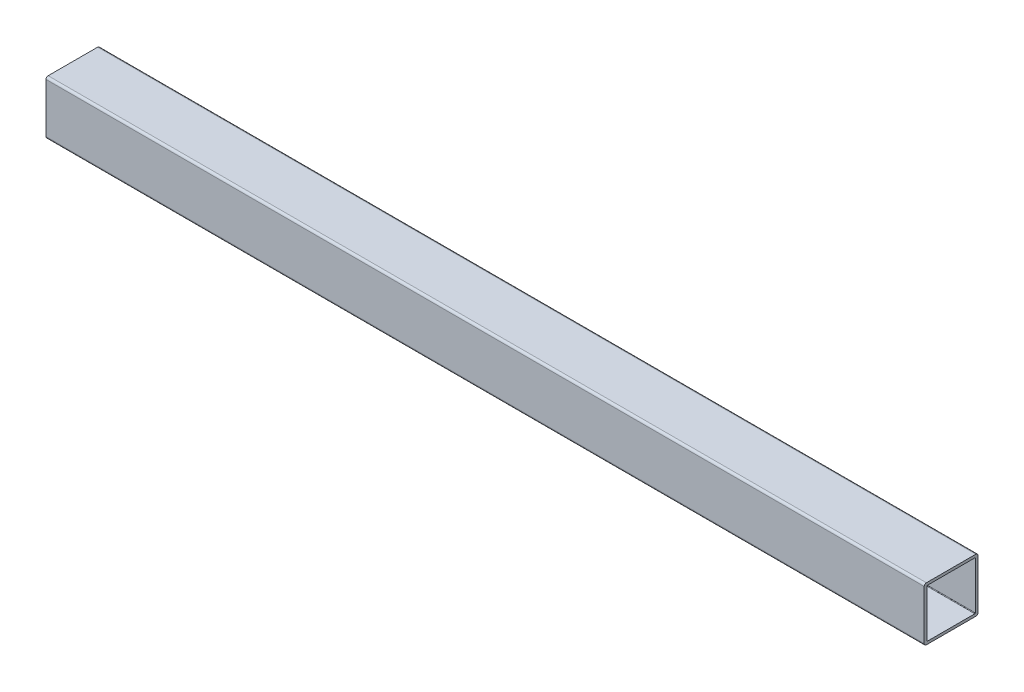
ISO-10303-21;
HEADER;
FILE_DESCRIPTION(('STEP AP214'),'2;1');
FILE_NAME('part.step','',(''),(''),'','','');
FILE_SCHEMA(('AUTOMOTIVE_DESIGN { 1 0 10303 214 1 1 1 1 }'));
ENDSEC;
DATA;
#1=APPLICATION_CONTEXT('core data for automotive mechanical design processes');
#2=APPLICATION_PROTOCOL_DEFINITION('international standard','automotive_design',2000,#1);
#3=PRODUCT_CONTEXT('',#1,'mechanical');
#4=PRODUCT('Part','Part','',(#3));
#5=PRODUCT_RELATED_PRODUCT_CATEGORY('part','',(#4));
#6=PRODUCT_DEFINITION_FORMATION('','',#4);
#7=PRODUCT_DEFINITION_CONTEXT('part definition',#1,'design');
#8=PRODUCT_DEFINITION('design','',#6,#7);
#9=PRODUCT_DEFINITION_SHAPE('','',#8);
#10=(LENGTH_UNIT() NAMED_UNIT(*) SI_UNIT(.MILLI.,.METRE.));
#11=(NAMED_UNIT(*) PLANE_ANGLE_UNIT() SI_UNIT($,.RADIAN.));
#12=(NAMED_UNIT(*) SI_UNIT($,.STERADIAN.) SOLID_ANGLE_UNIT());
#13=UNCERTAINTY_MEASURE_WITH_UNIT(LENGTH_MEASURE(1.E-05),#10,'distance_accuracy_value','');
#14=(GEOMETRIC_REPRESENTATION_CONTEXT(3) GLOBAL_UNCERTAINTY_ASSIGNED_CONTEXT((#13)) GLOBAL_UNIT_ASSIGNED_CONTEXT((#10,
#11,#12)) REPRESENTATION_CONTEXT('',''));
#15=CARTESIAN_POINT('',(0.,0.,0.));
#16=DIRECTION('',(0.,0.,1.));
#17=DIRECTION('',(1.,0.,0.));
#18=AXIS2_PLACEMENT_3D('',#15,#16,#17);
#19=CARTESIAN_POINT('',(-358.3,0.,-487.5));
#20=DIRECTION('',(0.,0.,-1.));
#21=DIRECTION('',(-1.,0.,0.));
#22=AXIS2_PLACEMENT_3D('',#19,#20,#21);
#23=PLANE('',#22);
#24=DIRECTION('',(0.,1.,0.));
#25=VECTOR('',#24,1.);
#26=CARTESIAN_POINT('',(-458.3,100.,-487.5));
#27=LINE('',#26,#25);
#28=CARTESIAN_POINT('',(-458.3,4.,-487.5));
#29=VERTEX_POINT('',#28);
#30=CARTESIAN_POINT('',(-458.3,96.,-487.5));
#31=VERTEX_POINT('',#30);
#32=EDGE_CURVE('E175',#29,#31,#27,.T.);
#33=ORIENTED_EDGE('',*,*,#32,.T.);
#34=DIRECTION('',(1.,0.,0.));
#35=VECTOR('',#34,1.);
#36=CARTESIAN_POINT('',(-358.3,96.,-487.5));
#37=LINE('',#36,#35);
#38=CARTESIAN_POINT('',(1175.,96.,-487.5));
#39=VERTEX_POINT('',#38);
#40=EDGE_CURVE('E216',#31,#39,#37,.T.);
#41=ORIENTED_EDGE('',*,*,#40,.T.);
#42=DIRECTION('',(0.,1.,0.));
#43=VECTOR('',#42,1.);
#44=CARTESIAN_POINT('',(1175.,100.,-487.5));
#45=LINE('',#44,#43);
#46=CARTESIAN_POINT('',(1175.,4.,-487.5));
#47=VERTEX_POINT('',#46);
#48=EDGE_CURVE('E161',#39,#47,#45,.F.);
#49=ORIENTED_EDGE('',*,*,#48,.T.);
#50=DIRECTION('',(1.,0.,0.));
#51=VECTOR('',#50,1.);
#52=CARTESIAN_POINT('',(-358.3,4.,-487.5));
#53=LINE('',#52,#51);
#54=EDGE_CURVE('E214',#47,#29,#53,.F.);
#55=ORIENTED_EDGE('',*,*,#54,.T.);
#56=EDGE_LOOP('',(#33,#41,#49,#55));
#57=FACE_BOUND('',#56,.T.);
#58=ADVANCED_FACE('F19',(#57),#23,.T.);
#59=CARTESIAN_POINT('',(-358.3,100.,-387.5));
#60=DIRECTION('',(0.,0.,1.));
#61=DIRECTION('',(1.,0.,0.));
#62=AXIS2_PLACEMENT_3D('',#59,#60,#61);
#63=PLANE('',#62);
#64=DIRECTION('',(0.,-1.,0.));
#65=VECTOR('',#64,1.);
#66=CARTESIAN_POINT('',(-458.3,100.,-387.5));
#67=LINE('',#66,#65);
#68=CARTESIAN_POINT('',(-458.3,96.,-387.5));
#69=VERTEX_POINT('',#68);
#70=CARTESIAN_POINT('',(-458.3,4.,-387.5));
#71=VERTEX_POINT('',#70);
#72=EDGE_CURVE('E189',#69,#71,#67,.T.);
#73=ORIENTED_EDGE('',*,*,#72,.T.);
#74=DIRECTION('',(-1.,0.,0.));
#75=VECTOR('',#74,1.);
#76=CARTESIAN_POINT('',(-358.3,4.,-387.5));
#77=LINE('',#76,#75);
#78=CARTESIAN_POINT('',(1175.,4.,-387.5));
#79=VERTEX_POINT('',#78);
#80=EDGE_CURVE('E138',#71,#79,#77,.F.);
#81=ORIENTED_EDGE('',*,*,#80,.T.);
#82=DIRECTION('',(0.,1.,0.));
#83=VECTOR('',#82,1.);
#84=CARTESIAN_POINT('',(1175.,100.,-387.5));
#85=LINE('',#84,#83);
#86=CARTESIAN_POINT('',(1175.,96.,-387.5));
#87=VERTEX_POINT('',#86);
#88=EDGE_CURVE('E192',#87,#79,#85,.F.);
#89=ORIENTED_EDGE('',*,*,#88,.F.);
#90=DIRECTION('',(-1.,0.,0.));
#91=VECTOR('',#90,1.);
#92=CARTESIAN_POINT('',(-358.3,96.,-387.5));
#93=LINE('',#92,#91);
#94=EDGE_CURVE('E142',#87,#69,#93,.T.);
#95=ORIENTED_EDGE('',*,*,#94,.T.);
#96=EDGE_LOOP('',(#73,#81,#89,#95));
#97=FACE_BOUND('',#96,.T.);
#98=ADVANCED_FACE('F253',(#97),#63,.T.);
#99=CARTESIAN_POINT('',(1175.,100.,-825.));
#100=DIRECTION('',(-1.,0.,0.));
#101=DIRECTION('',(0.,0.,1.));
#102=AXIS2_PLACEMENT_3D('',#99,#100,#101);
#103=PLANE('',#102);
#104=DIRECTION('',(0.,0.,1.));
#105=VECTOR('',#104,1.);
#106=CARTESIAN_POINT('',(1175.,5.,-825.));
#107=LINE('',#106,#105);
#108=CARTESIAN_POINT('',(1175.,5.,-481.5));
#109=VERTEX_POINT('',#108);
#110=CARTESIAN_POINT('',(1175.,5.,-393.5));
#111=VERTEX_POINT('',#110);
#112=EDGE_CURVE('E361',#109,#111,#107,.T.);
#113=ORIENTED_EDGE('',*,*,#112,.T.);
#114=CARTESIAN_POINT('',(1175.,6.,-393.5));
#115=DIRECTION('',(-1.,0.,0.));
#116=DIRECTION('',(0.,0.,1.));
#117=AXIS2_PLACEMENT_3D('',#114,#115,#116);
#118=CIRCLE('',#117,1.);
#119=CARTESIAN_POINT('',(1175.,6.00000000000001,-392.5));
#120=VERTEX_POINT('',#119);
#121=EDGE_CURVE('E326',#111,#120,#118,.T.);
#122=ORIENTED_EDGE('',*,*,#121,.T.);
#123=DIRECTION('',(0.,1.,0.));
#124=VECTOR('',#123,1.);
#125=CARTESIAN_POINT('',(1175.,100.,-392.5));
#126=LINE('',#125,#124);
#127=CARTESIAN_POINT('',(1175.,94.,-392.5));
#128=VERTEX_POINT('',#127);
#129=EDGE_CURVE('E190',#120,#128,#126,.T.);
#130=ORIENTED_EDGE('',*,*,#129,.T.);
#131=CARTESIAN_POINT('',(1175.,94.,-393.5));
#132=DIRECTION('',(-1.,0.,0.));
#133=DIRECTION('',(0.,0.,1.));
#134=AXIS2_PLACEMENT_3D('',#131,#132,#133);
#135=CIRCLE('',#134,1.);
#136=CARTESIAN_POINT('',(1175.,95.,-393.5));
#137=VERTEX_POINT('',#136);
#138=EDGE_CURVE('E332',#128,#137,#135,.T.);
#139=ORIENTED_EDGE('',*,*,#138,.T.);
#140=DIRECTION('',(0.,0.,-1.));
#141=VECTOR('',#140,1.);
#142=CARTESIAN_POINT('',(1175.,95.,-825.));
#143=LINE('',#142,#141);
#144=CARTESIAN_POINT('',(1175.,95.,-481.5));
#145=VERTEX_POINT('',#144);
#146=EDGE_CURVE('E186',#137,#145,#143,.T.);
#147=ORIENTED_EDGE('',*,*,#146,.T.);
#148=CARTESIAN_POINT('',(1175.,94.,-481.5));
#149=DIRECTION('',(-1.,0.,0.));
#150=DIRECTION('',(0.,0.,1.));
#151=AXIS2_PLACEMENT_3D('',#148,#149,#150);
#152=CIRCLE('',#151,1.);
#153=CARTESIAN_POINT('',(1175.,94.,-482.5));
#154=VERTEX_POINT('',#153);
#155=EDGE_CURVE('E12',#145,#154,#152,.T.);
#156=ORIENTED_EDGE('',*,*,#155,.T.);
#157=DIRECTION('',(0.,-1.,0.));
#158=VECTOR('',#157,1.);
#159=CARTESIAN_POINT('',(1175.,100.,-482.5));
#160=LINE('',#159,#158);
#161=CARTESIAN_POINT('',(1175.,6.00000000000001,-482.5));
#162=VERTEX_POINT('',#161);
#163=EDGE_CURVE('E355',#154,#162,#160,.T.);
#164=ORIENTED_EDGE('',*,*,#163,.T.);
#165=CARTESIAN_POINT('',(1175.,6.,-481.5));
#166=DIRECTION('',(-1.,0.,0.));
#167=DIRECTION('',(0.,0.,1.));
#168=AXIS2_PLACEMENT_3D('',#165,#166,#167);
#169=CIRCLE('',#168,1.);
#170=EDGE_CURVE('E319',#162,#109,#169,.T.);
#171=ORIENTED_EDGE('',*,*,#170,.T.);
#172=EDGE_LOOP('',(#113,#122,#130,#139,#147,#156,#164,#171));
#173=FACE_BOUND('',#172,.T.);
#174=ORIENTED_EDGE('',*,*,#88,.T.);
#175=CARTESIAN_POINT('',(1175.,4.,-391.5));
#176=DIRECTION('',(-1.,0.,0.));
#177=DIRECTION('',(0.,0.,1.));
#178=AXIS2_PLACEMENT_3D('',#175,#176,#177);
#179=CIRCLE('',#178,4.);
#180=CARTESIAN_POINT('',(1175.,0.,-391.5));
#181=VERTEX_POINT('',#180);
#182=EDGE_CURVE('E203',#79,#181,#179,.F.);
#183=ORIENTED_EDGE('',*,*,#182,.T.);
#184=DIRECTION('',(0.,0.,-1.));
#185=VECTOR('',#184,1.);
#186=CARTESIAN_POINT('',(1175.,0.,0.));
#187=LINE('',#186,#185);
#188=CARTESIAN_POINT('',(1175.,0.,-483.5));
#189=VERTEX_POINT('',#188);
#190=EDGE_CURVE('E153',#181,#189,#187,.T.);
#191=ORIENTED_EDGE('',*,*,#190,.T.);
#192=CARTESIAN_POINT('',(1175.,4.,-483.5));
#193=DIRECTION('',(-1.,0.,0.));
#194=DIRECTION('',(0.,0.,1.));
#195=AXIS2_PLACEMENT_3D('',#192,#193,#194);
#196=CIRCLE('',#195,4.);
#197=EDGE_CURVE('E202',#189,#47,#196,.F.);
#198=ORIENTED_EDGE('',*,*,#197,.T.);
#199=ORIENTED_EDGE('',*,*,#48,.F.);
#200=CARTESIAN_POINT('',(1175.,96.,-483.5));
#201=DIRECTION('',(-1.,0.,0.));
#202=DIRECTION('',(0.,0.,1.));
#203=AXIS2_PLACEMENT_3D('',#200,#201,#202);
#204=CIRCLE('',#203,4.);
#205=CARTESIAN_POINT('',(1175.,100.,-483.5));
#206=VERTEX_POINT('',#205);
#207=EDGE_CURVE('E209',#39,#206,#204,.F.);
#208=ORIENTED_EDGE('',*,*,#207,.T.);
#209=DIRECTION('',(0.,0.,-1.));
#210=VECTOR('',#209,1.);
#211=CARTESIAN_POINT('',(1175.,100.,0.));
#212=LINE('',#211,#210);
#213=CARTESIAN_POINT('',(1175.,100.,-391.5));
#214=VERTEX_POINT('',#213);
#215=EDGE_CURVE('E160',#214,#206,#212,.T.);
#216=ORIENTED_EDGE('',*,*,#215,.F.);
#217=CARTESIAN_POINT('',(1175.,96.,-391.5));
#218=DIRECTION('',(-1.,0.,0.));
#219=DIRECTION('',(0.,0.,1.));
#220=AXIS2_PLACEMENT_3D('',#217,#218,#219);
#221=CIRCLE('',#220,4.);
#222=EDGE_CURVE('E205',#214,#87,#221,.F.);
#223=ORIENTED_EDGE('',*,*,#222,.T.);
#224=EDGE_LOOP('',(#174,#183,#191,#198,#199,#208,#216,#223));
#225=FACE_BOUND('',#224,.T.);
#226=ADVANCED_FACE('F200',(#173,#225),#103,.F.);
#227=CARTESIAN_POINT('',(-458.3,100.,-387.5));
#228=DIRECTION('',(1.,0.,0.));
#229=DIRECTION('',(0.,0.,-1.));
#230=AXIS2_PLACEMENT_3D('',#227,#228,#229);
#231=PLANE('',#230);
#232=DIRECTION('',(0.,0.,1.));
#233=VECTOR('',#232,1.);
#234=CARTESIAN_POINT('',(-458.3,95.,-387.5));
#235=LINE('',#234,#233);
#236=CARTESIAN_POINT('',(-458.3,95.,-481.5));
#237=VERTEX_POINT('',#236);
#238=CARTESIAN_POINT('',(-458.3,95.,-393.5));
#239=VERTEX_POINT('',#238);
#240=EDGE_CURVE('E263',#237,#239,#235,.T.);
#241=ORIENTED_EDGE('',*,*,#240,.T.);
#242=CARTESIAN_POINT('',(-458.3,94.,-393.5));
#243=DIRECTION('',(1.,0.,0.));
#244=DIRECTION('',(0.,0.,-1.));
#245=AXIS2_PLACEMENT_3D('',#242,#243,#244);
#246=CIRCLE('',#245,1.);
#247=CARTESIAN_POINT('',(-458.3,94.,-392.5));
#248=VERTEX_POINT('',#247);
#249=EDGE_CURVE('E334',#239,#248,#246,.T.);
#250=ORIENTED_EDGE('',*,*,#249,.T.);
#251=DIRECTION('',(0.,-1.,0.));
#252=VECTOR('',#251,1.);
#253=CARTESIAN_POINT('',(-458.3,100.,-392.5));
#254=LINE('',#253,#252);
#255=CARTESIAN_POINT('',(-458.3,6.00000000000001,-392.5));
#256=VERTEX_POINT('',#255);
#257=EDGE_CURVE('E260',#248,#256,#254,.T.);
#258=ORIENTED_EDGE('',*,*,#257,.T.);
#259=CARTESIAN_POINT('',(-458.3,6.,-393.5));
#260=DIRECTION('',(1.,0.,0.));
#261=DIRECTION('',(0.,0.,-1.));
#262=AXIS2_PLACEMENT_3D('',#259,#260,#261);
#263=CIRCLE('',#262,1.);
#264=CARTESIAN_POINT('',(-458.3,5.,-393.5));
#265=VERTEX_POINT('',#264);
#266=EDGE_CURVE('E330',#256,#265,#263,.T.);
#267=ORIENTED_EDGE('',*,*,#266,.T.);
#268=DIRECTION('',(0.,0.,-1.));
#269=VECTOR('',#268,1.);
#270=CARTESIAN_POINT('',(-458.3,5.,-387.5));
#271=LINE('',#270,#269);
#272=CARTESIAN_POINT('',(-458.3,5.,-481.5));
#273=VERTEX_POINT('',#272);
#274=EDGE_CURVE('E198',#265,#273,#271,.T.);
#275=ORIENTED_EDGE('',*,*,#274,.T.);
#276=CARTESIAN_POINT('',(-458.3,6.,-481.5));
#277=DIRECTION('',(1.,0.,0.));
#278=DIRECTION('',(0.,0.,-1.));
#279=AXIS2_PLACEMENT_3D('',#276,#277,#278);
#280=CIRCLE('',#279,1.);
#281=CARTESIAN_POINT('',(-458.3,6.00000000000001,-482.5));
#282=VERTEX_POINT('',#281);
#283=EDGE_CURVE('E324',#273,#282,#280,.T.);
#284=ORIENTED_EDGE('',*,*,#283,.T.);
#285=DIRECTION('',(0.,1.,0.));
#286=VECTOR('',#285,1.);
#287=CARTESIAN_POINT('',(-458.3,100.,-482.5));
#288=LINE('',#287,#286);
#289=CARTESIAN_POINT('',(-458.3,94.,-482.5));
#290=VERTEX_POINT('',#289);
#291=EDGE_CURVE('E194',#282,#290,#288,.T.);
#292=ORIENTED_EDGE('',*,*,#291,.T.);
#293=CARTESIAN_POINT('',(-458.3,94.,-481.5));
#294=DIRECTION('',(1.,0.,0.));
#295=DIRECTION('',(0.,0.,-1.));
#296=AXIS2_PLACEMENT_3D('',#293,#294,#295);
#297=CIRCLE('',#296,1.);
#298=EDGE_CURVE('E27',#290,#237,#297,.T.);
#299=ORIENTED_EDGE('',*,*,#298,.T.);
#300=EDGE_LOOP('',(#241,#250,#258,#267,#275,#284,#292,#299));
#301=FACE_BOUND('',#300,.T.);
#302=CARTESIAN_POINT('',(-458.3,4.,-391.5));
#303=DIRECTION('',(1.,0.,0.));
#304=DIRECTION('',(0.,0.,-1.));
#305=AXIS2_PLACEMENT_3D('',#302,#303,#304);
#306=CIRCLE('',#305,4.);
#307=CARTESIAN_POINT('',(-458.3,0.,-391.5));
#308=VERTEX_POINT('',#307);
#309=EDGE_CURVE('E133',#308,#71,#306,.F.);
#310=ORIENTED_EDGE('',*,*,#309,.T.);
#311=ORIENTED_EDGE('',*,*,#72,.F.);
#312=CARTESIAN_POINT('',(-458.3,96.,-391.5));
#313=DIRECTION('',(1.,0.,0.));
#314=DIRECTION('',(0.,0.,-1.));
#315=AXIS2_PLACEMENT_3D('',#312,#313,#314);
#316=CIRCLE('',#315,4.);
#317=CARTESIAN_POINT('',(-458.3,100.,-391.5));
#318=VERTEX_POINT('',#317);
#319=EDGE_CURVE('E143',#69,#318,#316,.F.);
#320=ORIENTED_EDGE('',*,*,#319,.T.);
#321=DIRECTION('',(0.,0.,1.));
#322=VECTOR('',#321,1.);
#323=CARTESIAN_POINT('',(-458.3,100.,-387.5));
#324=LINE('',#323,#322);
#325=CARTESIAN_POINT('',(-458.3,100.,-483.5));
#326=VERTEX_POINT('',#325);
#327=EDGE_CURVE('E166',#326,#318,#324,.T.);
#328=ORIENTED_EDGE('',*,*,#327,.F.);
#329=CARTESIAN_POINT('',(-458.3,96.,-483.5));
#330=DIRECTION('',(1.,0.,0.));
#331=DIRECTION('',(0.,0.,-1.));
#332=AXIS2_PLACEMENT_3D('',#329,#330,#331);
#333=CIRCLE('',#332,4.);
#334=EDGE_CURVE('E231',#326,#31,#333,.F.);
#335=ORIENTED_EDGE('',*,*,#334,.T.);
#336=ORIENTED_EDGE('',*,*,#32,.F.);
#337=CARTESIAN_POINT('',(-458.3,4.,-483.5));
#338=DIRECTION('',(1.,0.,0.));
#339=DIRECTION('',(0.,0.,-1.));
#340=AXIS2_PLACEMENT_3D('',#337,#338,#339);
#341=CIRCLE('',#340,4.);
#342=CARTESIAN_POINT('',(-458.3,0.,-483.5));
#343=VERTEX_POINT('',#342);
#344=EDGE_CURVE('E154',#29,#343,#341,.F.);
#345=ORIENTED_EDGE('',*,*,#344,.T.);
#346=DIRECTION('',(0.,0.,-1.));
#347=VECTOR('',#346,1.);
#348=CARTESIAN_POINT('',(-458.3,0.,0.));
#349=LINE('',#348,#347);
#350=EDGE_CURVE('E150',#308,#343,#349,.T.);
#351=ORIENTED_EDGE('',*,*,#350,.F.);
#352=EDGE_LOOP('',(#310,#311,#320,#328,#335,#336,#345,#351));
#353=FACE_BOUND('',#352,.T.);
#354=ADVANCED_FACE('F157',(#301,#353),#231,.F.);
#355=CARTESIAN_POINT('',(0.,0.,0.));
#356=DIRECTION('',(0.,-1.,0.));
#357=DIRECTION('',(0.,0.,-1.));
#358=AXIS2_PLACEMENT_3D('',#355,#356,#357);
#359=PLANE('',#358);
#360=ORIENTED_EDGE('',*,*,#190,.F.);
#361=DIRECTION('',(-1.,0.,0.));
#362=VECTOR('',#361,1.);
#363=CARTESIAN_POINT('',(0.,0.,-391.5));
#364=LINE('',#363,#362);
#365=EDGE_CURVE('E137',#181,#308,#364,.T.);
#366=ORIENTED_EDGE('',*,*,#365,.T.);
#367=ORIENTED_EDGE('',*,*,#350,.T.);
#368=DIRECTION('',(1.,0.,0.));
#369=VECTOR('',#368,1.);
#370=CARTESIAN_POINT('',(0.,0.,-483.5));
#371=LINE('',#370,#369);
#372=EDGE_CURVE('E155',#343,#189,#371,.T.);
#373=ORIENTED_EDGE('',*,*,#372,.T.);
#374=EDGE_LOOP('',(#360,#366,#367,#373));
#375=FACE_BOUND('',#374,.T.);
#376=ADVANCED_FACE('F148',(#375),#359,.T.);
#377=CARTESIAN_POINT('',(358.3,100.,925.));
#378=DIRECTION('',(0.,1.,0.));
#379=DIRECTION('',(0.,0.,1.));
#380=AXIS2_PLACEMENT_3D('',#377,#378,#379);
#381=PLANE('',#380);
#382=ORIENTED_EDGE('',*,*,#327,.T.);
#383=DIRECTION('',(-1.,0.,0.));
#384=VECTOR('',#383,1.);
#385=CARTESIAN_POINT('',(358.3,100.,-391.5));
#386=LINE('',#385,#384);
#387=EDGE_CURVE('E207',#318,#214,#386,.F.);
#388=ORIENTED_EDGE('',*,*,#387,.T.);
#389=ORIENTED_EDGE('',*,*,#215,.T.);
#390=DIRECTION('',(1.,0.,0.));
#391=VECTOR('',#390,1.);
#392=CARTESIAN_POINT('',(358.3,100.,-483.5));
#393=LINE('',#392,#391);
#394=EDGE_CURVE('E204',#206,#326,#393,.F.);
#395=ORIENTED_EDGE('',*,*,#394,.T.);
#396=EDGE_LOOP('',(#382,#388,#389,#395));
#397=FACE_BOUND('',#396,.T.);
#398=ADVANCED_FACE('F244',(#397),#381,.T.);
#399=CARTESIAN_POINT('',(1275.,95.,-392.5));
#400=DIRECTION('',(0.,1.,0.));
#401=DIRECTION('',(0.,0.,1.));
#402=AXIS2_PLACEMENT_3D('',#399,#400,#401);
#403=PLANE('',#402);
#404=ORIENTED_EDGE('',*,*,#146,.F.);
#405=DIRECTION('',(-1.,0.,0.));
#406=VECTOR('',#405,1.);
#407=CARTESIAN_POINT('',(-458.3,95.,-393.5));
#408=LINE('',#407,#406);
#409=EDGE_CURVE('E347',#137,#239,#408,.T.);
#410=ORIENTED_EDGE('',*,*,#409,.T.);
#411=ORIENTED_EDGE('',*,*,#240,.F.);
#412=DIRECTION('',(-1.,0.,0.));
#413=VECTOR('',#412,1.);
#414=CARTESIAN_POINT('',(1175.,95.,-481.5));
#415=LINE('',#414,#413);
#416=EDGE_CURVE('E220',#237,#145,#415,.F.);
#417=ORIENTED_EDGE('',*,*,#416,.T.);
#418=EDGE_LOOP('',(#404,#410,#411,#417));
#419=FACE_BOUND('',#418,.T.);
#420=ADVANCED_FACE('F282',(#419),#403,.F.);
#421=CARTESIAN_POINT('',(1275.,5.,-392.5));
#422=DIRECTION('',(0.,0.,1.));
#423=DIRECTION('',(1.,0.,0.));
#424=AXIS2_PLACEMENT_3D('',#421,#422,#423);
#425=PLANE('',#424);
#426=ORIENTED_EDGE('',*,*,#257,.F.);
#427=DIRECTION('',(-1.,0.,0.));
#428=VECTOR('',#427,1.);
#429=CARTESIAN_POINT('',(1175.,94.,-392.5));
#430=LINE('',#429,#428);
#431=EDGE_CURVE('E343',#248,#128,#430,.F.);
#432=ORIENTED_EDGE('',*,*,#431,.T.);
#433=ORIENTED_EDGE('',*,*,#129,.F.);
#434=DIRECTION('',(-1.,0.,0.));
#435=VECTOR('',#434,1.);
#436=CARTESIAN_POINT('',(-458.3,6.,-392.5));
#437=LINE('',#436,#435);
#438=EDGE_CURVE('E345',#120,#256,#437,.T.);
#439=ORIENTED_EDGE('',*,*,#438,.T.);
#440=EDGE_LOOP('',(#426,#432,#433,#439));
#441=FACE_BOUND('',#440,.T.);
#442=ADVANCED_FACE('F288',(#441),#425,.F.);
#443=CARTESIAN_POINT('',(1275.,5.,-482.5));
#444=DIRECTION('',(0.,-1.,0.));
#445=DIRECTION('',(0.,0.,-1.));
#446=AXIS2_PLACEMENT_3D('',#443,#444,#445);
#447=PLANE('',#446);
#448=ORIENTED_EDGE('',*,*,#274,.F.);
#449=DIRECTION('',(-1.,0.,0.));
#450=VECTOR('',#449,1.);
#451=CARTESIAN_POINT('',(1175.,5.,-393.5));
#452=LINE('',#451,#450);
#453=EDGE_CURVE('E340',#265,#111,#452,.F.);
#454=ORIENTED_EDGE('',*,*,#453,.T.);
#455=ORIENTED_EDGE('',*,*,#112,.F.);
#456=DIRECTION('',(-1.,0.,0.));
#457=VECTOR('',#456,1.);
#458=CARTESIAN_POINT('',(-458.3,5.,-481.5));
#459=LINE('',#458,#457);
#460=EDGE_CURVE('E321',#109,#273,#459,.T.);
#461=ORIENTED_EDGE('',*,*,#460,.T.);
#462=EDGE_LOOP('',(#448,#454,#455,#461));
#463=FACE_BOUND('',#462,.T.);
#464=ADVANCED_FACE('F359',(#463),#447,.F.);
#465=CARTESIAN_POINT('',(1275.,95.,-482.5));
#466=DIRECTION('',(0.,0.,-1.));
#467=DIRECTION('',(-1.,0.,0.));
#468=AXIS2_PLACEMENT_3D('',#465,#466,#467);
#469=PLANE('',#468);
#470=ORIENTED_EDGE('',*,*,#291,.F.);
#471=DIRECTION('',(-1.,0.,0.));
#472=VECTOR('',#471,1.);
#473=CARTESIAN_POINT('',(1175.,6.,-482.5));
#474=LINE('',#473,#472);
#475=EDGE_CURVE('E34',#282,#162,#474,.F.);
#476=ORIENTED_EDGE('',*,*,#475,.T.);
#477=ORIENTED_EDGE('',*,*,#163,.F.);
#478=DIRECTION('',(-1.,0.,0.));
#479=VECTOR('',#478,1.);
#480=CARTESIAN_POINT('',(-458.3,94.,-482.5));
#481=LINE('',#480,#479);
#482=EDGE_CURVE('E337',#154,#290,#481,.T.);
#483=ORIENTED_EDGE('',*,*,#482,.T.);
#484=EDGE_LOOP('',(#470,#476,#477,#483));
#485=FACE_BOUND('',#484,.T.);
#486=ADVANCED_FACE('F296',(#485),#469,.F.);
#487=CARTESIAN_POINT('',(0.,4.,-391.5));
#488=DIRECTION('',(-1.,0.,0.));
#489=DIRECTION('',(0.,0.,1.));
#490=AXIS2_PLACEMENT_3D('',#487,#488,#489);
#491=CYLINDRICAL_SURFACE('',#490,4.);
#492=ORIENTED_EDGE('',*,*,#182,.F.);
#493=ORIENTED_EDGE('',*,*,#80,.F.);
#494=ORIENTED_EDGE('',*,*,#309,.F.);
#495=ORIENTED_EDGE('',*,*,#365,.F.);
#496=EDGE_LOOP('',(#492,#493,#494,#495));
#497=FACE_BOUND('',#496,.T.);
#498=ADVANCED_FACE('F136',(#497),#491,.T.);
#499=CARTESIAN_POINT('',(-358.3,96.,-391.5));
#500=DIRECTION('',(-1.,0.,0.));
#501=DIRECTION('',(0.,0.,1.));
#502=AXIS2_PLACEMENT_3D('',#499,#500,#501);
#503=CYLINDRICAL_SURFACE('',#502,4.);
#504=ORIENTED_EDGE('',*,*,#222,.F.);
#505=ORIENTED_EDGE('',*,*,#387,.F.);
#506=ORIENTED_EDGE('',*,*,#319,.F.);
#507=ORIENTED_EDGE('',*,*,#94,.F.);
#508=EDGE_LOOP('',(#504,#505,#506,#507));
#509=FACE_BOUND('',#508,.T.);
#510=ADVANCED_FACE('F250',(#509),#503,.T.);
#511=CARTESIAN_POINT('',(-358.3,96.,-483.5));
#512=DIRECTION('',(1.,0.,0.));
#513=DIRECTION('',(0.,0.,-1.));
#514=AXIS2_PLACEMENT_3D('',#511,#512,#513);
#515=CYLINDRICAL_SURFACE('',#514,4.);
#516=ORIENTED_EDGE('',*,*,#334,.F.);
#517=ORIENTED_EDGE('',*,*,#394,.F.);
#518=ORIENTED_EDGE('',*,*,#207,.F.);
#519=ORIENTED_EDGE('',*,*,#40,.F.);
#520=EDGE_LOOP('',(#516,#517,#518,#519));
#521=FACE_BOUND('',#520,.T.);
#522=ADVANCED_FACE('F248',(#521),#515,.T.);
#523=CARTESIAN_POINT('',(0.,4.,-483.5));
#524=DIRECTION('',(1.,0.,0.));
#525=DIRECTION('',(0.,0.,-1.));
#526=AXIS2_PLACEMENT_3D('',#523,#524,#525);
#527=CYLINDRICAL_SURFACE('',#526,4.);
#528=ORIENTED_EDGE('',*,*,#344,.F.);
#529=ORIENTED_EDGE('',*,*,#54,.F.);
#530=ORIENTED_EDGE('',*,*,#197,.F.);
#531=ORIENTED_EDGE('',*,*,#372,.F.);
#532=EDGE_LOOP('',(#528,#529,#530,#531));
#533=FACE_BOUND('',#532,.T.);
#534=ADVANCED_FACE('F270',(#533),#527,.T.);
#535=CARTESIAN_POINT('',(1275.,94.,-393.5));
#536=DIRECTION('',(1.,0.,0.));
#537=DIRECTION('',(0.,0.,-1.));
#538=AXIS2_PLACEMENT_3D('',#535,#536,#537);
#539=CYLINDRICAL_SURFACE('',#538,1.);
#540=ORIENTED_EDGE('',*,*,#138,.F.);
#541=ORIENTED_EDGE('',*,*,#431,.F.);
#542=ORIENTED_EDGE('',*,*,#249,.F.);
#543=ORIENTED_EDGE('',*,*,#409,.F.);
#544=EDGE_LOOP('',(#540,#541,#542,#543));
#545=FACE_BOUND('',#544,.T.);
#546=ADVANCED_FACE('F303',(#545),#539,.F.);
#547=CARTESIAN_POINT('',(1275.,6.,-393.5));
#548=DIRECTION('',(1.,0.,0.));
#549=DIRECTION('',(0.,0.,-1.));
#550=AXIS2_PLACEMENT_3D('',#547,#548,#549);
#551=CYLINDRICAL_SURFACE('',#550,1.);
#552=ORIENTED_EDGE('',*,*,#121,.F.);
#553=ORIENTED_EDGE('',*,*,#453,.F.);
#554=ORIENTED_EDGE('',*,*,#266,.F.);
#555=ORIENTED_EDGE('',*,*,#438,.F.);
#556=EDGE_LOOP('',(#552,#553,#554,#555));
#557=FACE_BOUND('',#556,.T.);
#558=ADVANCED_FACE('F306',(#557),#551,.F.);
#559=CARTESIAN_POINT('',(1275.,6.,-481.5));
#560=DIRECTION('',(1.,0.,0.));
#561=DIRECTION('',(0.,0.,-1.));
#562=AXIS2_PLACEMENT_3D('',#559,#560,#561);
#563=CYLINDRICAL_SURFACE('',#562,1.);
#564=ORIENTED_EDGE('',*,*,#170,.F.);
#565=ORIENTED_EDGE('',*,*,#475,.F.);
#566=ORIENTED_EDGE('',*,*,#283,.F.);
#567=ORIENTED_EDGE('',*,*,#460,.F.);
#568=EDGE_LOOP('',(#564,#565,#566,#567));
#569=FACE_BOUND('',#568,.T.);
#570=ADVANCED_FACE('F309',(#569),#563,.F.);
#571=CARTESIAN_POINT('',(1275.,94.,-481.5));
#572=DIRECTION('',(1.,0.,0.));
#573=DIRECTION('',(0.,0.,-1.));
#574=AXIS2_PLACEMENT_3D('',#571,#572,#573);
#575=CYLINDRICAL_SURFACE('',#574,1.);
#576=ORIENTED_EDGE('',*,*,#155,.F.);
#577=ORIENTED_EDGE('',*,*,#416,.F.);
#578=ORIENTED_EDGE('',*,*,#298,.F.);
#579=ORIENTED_EDGE('',*,*,#482,.F.);
#580=EDGE_LOOP('',(#576,#577,#578,#579));
#581=FACE_BOUND('',#580,.T.);
#582=ADVANCED_FACE('F21',(#581),#575,.F.);
#583=CLOSED_SHELL('',(#58,#98,#226,#354,#376,#398,#420,#442,#464,#486,#498,#510,#522,#534,#546,
#558,#570,#582));
#584=MANIFOLD_SOLID_BREP('B1',#583);
#585=ADVANCED_BREP_SHAPE_REPRESENTATION('',(#18,#584),#14);
#586=SHAPE_DEFINITION_REPRESENTATION(#9,#585);
ENDSEC;
END-ISO-10303-21;
